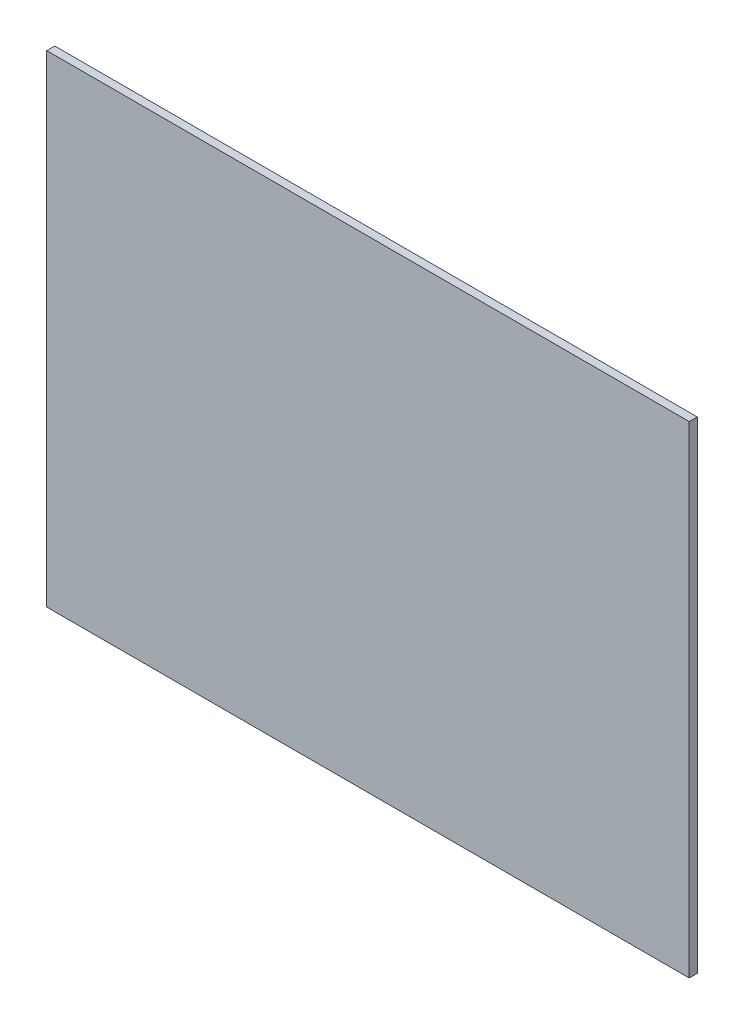
ISO-10303-21;
HEADER;
FILE_DESCRIPTION(('STEP AP214'),'2;1');
FILE_NAME('part.step','',(''),(''),'','','');
FILE_SCHEMA(('AUTOMOTIVE_DESIGN { 1 0 10303 214 1 1 1 1 }'));
ENDSEC;
DATA;
#1=APPLICATION_CONTEXT('core data for automotive mechanical design processes');
#2=APPLICATION_PROTOCOL_DEFINITION('international standard','automotive_design',2000,#1);
#3=PRODUCT_CONTEXT('',#1,'mechanical');
#4=PRODUCT('Part','Part','',(#3));
#5=PRODUCT_RELATED_PRODUCT_CATEGORY('part','',(#4));
#6=PRODUCT_DEFINITION_FORMATION('','',#4);
#7=PRODUCT_DEFINITION_CONTEXT('part definition',#1,'design');
#8=PRODUCT_DEFINITION('design','',#6,#7);
#9=PRODUCT_DEFINITION_SHAPE('','',#8);
#10=(LENGTH_UNIT() NAMED_UNIT(*) SI_UNIT(.MILLI.,.METRE.));
#11=(NAMED_UNIT(*) PLANE_ANGLE_UNIT() SI_UNIT($,.RADIAN.));
#12=(NAMED_UNIT(*) SI_UNIT($,.STERADIAN.) SOLID_ANGLE_UNIT());
#13=UNCERTAINTY_MEASURE_WITH_UNIT(LENGTH_MEASURE(1.E-05),#10,'distance_accuracy_value','');
#14=(GEOMETRIC_REPRESENTATION_CONTEXT(3) GLOBAL_UNCERTAINTY_ASSIGNED_CONTEXT((#13)) GLOBAL_UNIT_ASSIGNED_CONTEXT((#10,
#11,#12)) REPRESENTATION_CONTEXT('',''));
#15=CARTESIAN_POINT('',(0.,0.,0.));
#16=DIRECTION('',(0.,0.,1.));
#17=DIRECTION('',(1.,0.,0.));
#18=AXIS2_PLACEMENT_3D('',#15,#16,#17);
#19=CARTESIAN_POINT('',(-28.,-21.,-0.85));
#20=DIRECTION('',(0.,-1.,0.));
#21=DIRECTION('',(1.,0.,0.));
#22=AXIS2_PLACEMENT_3D('',#19,#20,#21);
#23=PLANE('',#22);
#24=DIRECTION('',(1.,0.,0.));
#25=VECTOR('',#24,1.);
#26=CARTESIAN_POINT('',(-28.,-21.,-0.15));
#27=LINE('',#26,#25);
#28=CARTESIAN_POINT('',(-28.,-21.,-0.15));
#29=VERTEX_POINT('',#28);
#30=CARTESIAN_POINT('',(28.,-21.,-0.15));
#31=VERTEX_POINT('',#30);
#32=EDGE_CURVE('E107',#29,#31,#27,.T.);
#33=ORIENTED_EDGE('',*,*,#32,.F.);
#34=DIRECTION('',(0.,0.,1.));
#35=VECTOR('',#34,1.);
#36=CARTESIAN_POINT('',(-28.,-21.,-0.85));
#37=LINE('',#36,#35);
#38=CARTESIAN_POINT('',(-28.,-21.,-0.85));
#39=VERTEX_POINT('',#38);
#40=EDGE_CURVE('E12',#39,#29,#37,.T.);
#41=ORIENTED_EDGE('',*,*,#40,.F.);
#42=DIRECTION('',(1.,0.,0.));
#43=VECTOR('',#42,1.);
#44=CARTESIAN_POINT('',(-28.,-21.,-0.85));
#45=LINE('',#44,#43);
#46=CARTESIAN_POINT('',(28.,-21.,-0.85));
#47=VERTEX_POINT('',#46);
#48=EDGE_CURVE('E102',#39,#47,#45,.T.);
#49=ORIENTED_EDGE('',*,*,#48,.T.);
#50=DIRECTION('',(0.,0.,1.));
#51=VECTOR('',#50,1.);
#52=CARTESIAN_POINT('',(28.,-21.,-0.85));
#53=LINE('',#52,#51);
#54=EDGE_CURVE('E45',#47,#31,#53,.T.);
#55=ORIENTED_EDGE('',*,*,#54,.T.);
#56=EDGE_LOOP('',(#33,#41,#49,#55));
#57=FACE_BOUND('',#56,.T.);
#58=ADVANCED_FACE('F42',(#57),#23,.T.);
#59=CARTESIAN_POINT('',(-28.,-21.,-0.85));
#60=DIRECTION('',(1.,0.,0.));
#61=DIRECTION('',(0.,0.,-1.));
#62=AXIS2_PLACEMENT_3D('',#59,#60,#61);
#63=PLANE('',#62);
#64=DIRECTION('',(0.,1.,0.));
#65=VECTOR('',#64,1.);
#66=CARTESIAN_POINT('',(-28.,-21.,-0.15));
#67=LINE('',#66,#65);
#68=CARTESIAN_POINT('',(-28.,21.,-0.15));
#69=VERTEX_POINT('',#68);
#70=EDGE_CURVE('E75',#29,#69,#67,.T.);
#71=ORIENTED_EDGE('',*,*,#70,.T.);
#72=DIRECTION('',(0.,0.,1.));
#73=VECTOR('',#72,1.);
#74=CARTESIAN_POINT('',(-28.,21.,-0.85));
#75=LINE('',#74,#73);
#76=CARTESIAN_POINT('',(-28.,21.,-0.85));
#77=VERTEX_POINT('',#76);
#78=EDGE_CURVE('E51',#77,#69,#75,.T.);
#79=ORIENTED_EDGE('',*,*,#78,.F.);
#80=DIRECTION('',(0.,1.,0.));
#81=VECTOR('',#80,1.);
#82=CARTESIAN_POINT('',(-28.,-21.,-0.85));
#83=LINE('',#82,#81);
#84=EDGE_CURVE('E92',#39,#77,#83,.T.);
#85=ORIENTED_EDGE('',*,*,#84,.F.);
#86=ORIENTED_EDGE('',*,*,#40,.T.);
#87=EDGE_LOOP('',(#71,#79,#85,#86));
#88=FACE_BOUND('',#87,.T.);
#89=ADVANCED_FACE('F117',(#88),#63,.F.);
#90=CARTESIAN_POINT('',(-28.,21.,-0.85));
#91=DIRECTION('',(0.,-1.,0.));
#92=DIRECTION('',(0.,0.,-1.));
#93=AXIS2_PLACEMENT_3D('',#90,#91,#92);
#94=PLANE('',#93);
#95=DIRECTION('',(1.,0.,0.));
#96=VECTOR('',#95,1.);
#97=CARTESIAN_POINT('',(-28.,21.,-0.15));
#98=LINE('',#97,#96);
#99=CARTESIAN_POINT('',(28.,21.,-0.15));
#100=VERTEX_POINT('',#99);
#101=EDGE_CURVE('E99',#69,#100,#98,.T.);
#102=ORIENTED_EDGE('',*,*,#101,.T.);
#103=DIRECTION('',(0.,0.,1.));
#104=VECTOR('',#103,1.);
#105=CARTESIAN_POINT('',(28.,21.,-0.85));
#106=LINE('',#105,#104);
#107=CARTESIAN_POINT('',(28.,21.,-0.85));
#108=VERTEX_POINT('',#107);
#109=EDGE_CURVE('E96',#108,#100,#106,.T.);
#110=ORIENTED_EDGE('',*,*,#109,.F.);
#111=DIRECTION('',(1.,0.,0.));
#112=VECTOR('',#111,1.);
#113=CARTESIAN_POINT('',(-28.,21.,-0.85));
#114=LINE('',#113,#112);
#115=EDGE_CURVE('E87',#77,#108,#114,.T.);
#116=ORIENTED_EDGE('',*,*,#115,.F.);
#117=ORIENTED_EDGE('',*,*,#78,.T.);
#118=EDGE_LOOP('',(#102,#110,#116,#117));
#119=FACE_BOUND('',#118,.T.);
#120=ADVANCED_FACE('F97',(#119),#94,.F.);
#121=CARTESIAN_POINT('',(28.,-21.,-0.85));
#122=DIRECTION('',(1.,0.,0.));
#123=DIRECTION('',(0.,0.,-1.));
#124=AXIS2_PLACEMENT_3D('',#121,#122,#123);
#125=PLANE('',#124);
#126=DIRECTION('',(0.,1.,0.));
#127=VECTOR('',#126,1.);
#128=CARTESIAN_POINT('',(28.,-21.,-0.15));
#129=LINE('',#128,#127);
#130=EDGE_CURVE('E110',#31,#100,#129,.T.);
#131=ORIENTED_EDGE('',*,*,#130,.F.);
#132=ORIENTED_EDGE('',*,*,#54,.F.);
#133=DIRECTION('',(0.,1.,0.));
#134=VECTOR('',#133,1.);
#135=CARTESIAN_POINT('',(28.,-21.,-0.85));
#136=LINE('',#135,#134);
#137=EDGE_CURVE('E91',#47,#108,#136,.T.);
#138=ORIENTED_EDGE('',*,*,#137,.T.);
#139=ORIENTED_EDGE('',*,*,#109,.T.);
#140=EDGE_LOOP('',(#131,#132,#138,#139));
#141=FACE_BOUND('',#140,.T.);
#142=ADVANCED_FACE('F101',(#141),#125,.T.);
#143=CARTESIAN_POINT('',(0.,0.,-0.85));
#144=DIRECTION('',(0.,0.,1.));
#145=DIRECTION('',(1.,0.,0.));
#146=AXIS2_PLACEMENT_3D('',#143,#144,#145);
#147=PLANE('',#146);
#148=ORIENTED_EDGE('',*,*,#48,.F.);
#149=ORIENTED_EDGE('',*,*,#84,.T.);
#150=ORIENTED_EDGE('',*,*,#115,.T.);
#151=ORIENTED_EDGE('',*,*,#137,.F.);
#152=EDGE_LOOP('',(#148,#149,#150,#151));
#153=FACE_BOUND('',#152,.T.);
#154=ADVANCED_FACE('F90',(#153),#147,.F.);
#155=CARTESIAN_POINT('',(0.,0.,-0.15));
#156=DIRECTION('',(0.,0.,1.));
#157=DIRECTION('',(1.,0.,0.));
#158=AXIS2_PLACEMENT_3D('',#155,#156,#157);
#159=PLANE('',#158);
#160=ORIENTED_EDGE('',*,*,#32,.T.);
#161=ORIENTED_EDGE('',*,*,#130,.T.);
#162=ORIENTED_EDGE('',*,*,#101,.F.);
#163=ORIENTED_EDGE('',*,*,#70,.F.);
#164=EDGE_LOOP('',(#160,#161,#162,#163));
#165=FACE_BOUND('',#164,.T.);
#166=ADVANCED_FACE('F115',(#165),#159,.T.);
#167=CLOSED_SHELL('',(#58,#89,#120,#142,#154,#166));
#168=MANIFOLD_SOLID_BREP('B2',#167);
#169=ADVANCED_BREP_SHAPE_REPRESENTATION('',(#18,#168),#14);
#170=SHAPE_DEFINITION_REPRESENTATION(#9,#169);
ENDSEC;
END-ISO-10303-21;
